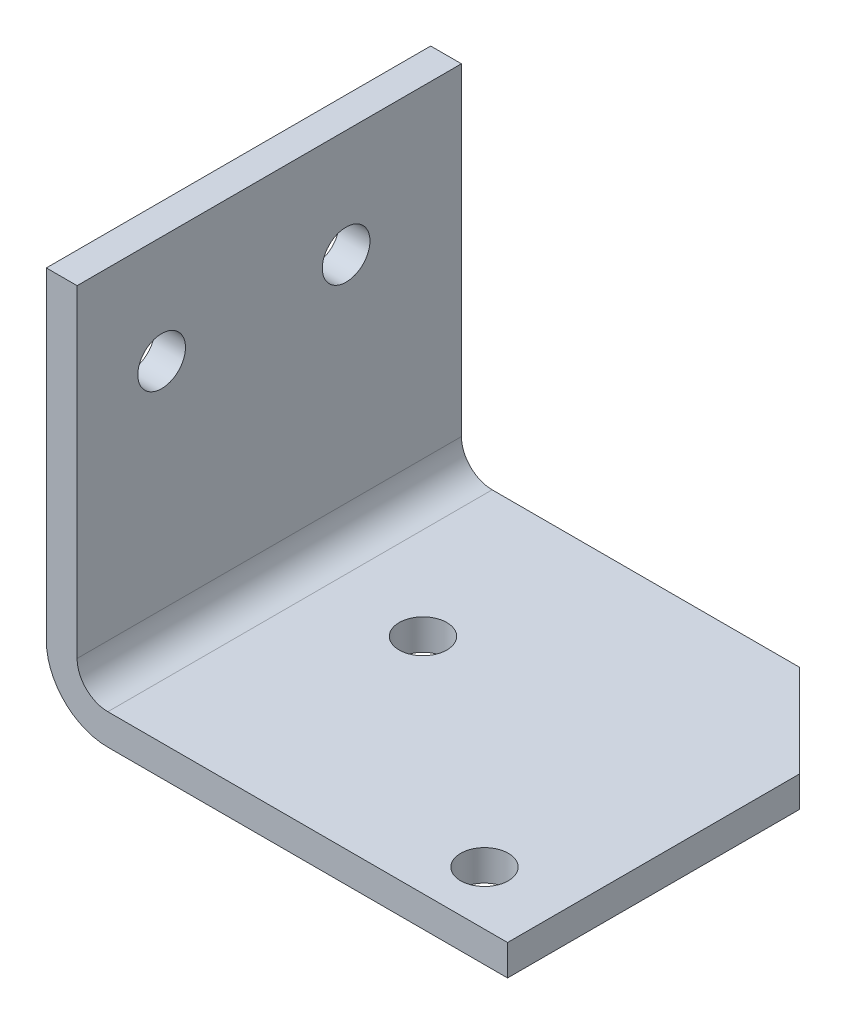
ISO-10303-21;
HEADER;
FILE_DESCRIPTION(('STEP AP214'),'2;1');
FILE_NAME('part.step','',(''),(''),'','','');
FILE_SCHEMA(('AUTOMOTIVE_DESIGN { 1 0 10303 214 1 1 1 1 }'));
ENDSEC;
DATA;
#1=APPLICATION_CONTEXT('core data for automotive mechanical design processes');
#2=APPLICATION_PROTOCOL_DEFINITION('international standard','automotive_design',2000,#1);
#3=PRODUCT_CONTEXT('',#1,'mechanical');
#4=PRODUCT('Part','Part','',(#3));
#5=PRODUCT_RELATED_PRODUCT_CATEGORY('part','',(#4));
#6=PRODUCT_DEFINITION_FORMATION('','',#4);
#7=PRODUCT_DEFINITION_CONTEXT('part definition',#1,'design');
#8=PRODUCT_DEFINITION('design','',#6,#7);
#9=PRODUCT_DEFINITION_SHAPE('','',#8);
#10=(LENGTH_UNIT() NAMED_UNIT(*) SI_UNIT(.MILLI.,.METRE.));
#11=(NAMED_UNIT(*) PLANE_ANGLE_UNIT() SI_UNIT($,.RADIAN.));
#12=(NAMED_UNIT(*) SI_UNIT($,.STERADIAN.) SOLID_ANGLE_UNIT());
#13=UNCERTAINTY_MEASURE_WITH_UNIT(LENGTH_MEASURE(1.E-05),#10,'distance_accuracy_value','');
#14=(GEOMETRIC_REPRESENTATION_CONTEXT(3) GLOBAL_UNCERTAINTY_ASSIGNED_CONTEXT((#13)) GLOBAL_UNIT_ASSIGNED_CONTEXT((#10,
#11,#12)) REPRESENTATION_CONTEXT('',''));
#15=CARTESIAN_POINT('',(0.,0.,0.));
#16=DIRECTION('',(0.,0.,1.));
#17=DIRECTION('',(1.,0.,0.));
#18=AXIS2_PLACEMENT_3D('',#15,#16,#17);
#19=CARTESIAN_POINT('',(0.,25.,25.));
#20=DIRECTION('',(1.,0.,0.));
#21=DIRECTION('',(0.,1.,0.));
#22=AXIS2_PLACEMENT_3D('',#19,#20,#21);
#23=PLANE('',#22);
#24=CARTESIAN_POINT('',(0.,18.,7.5));
#25=DIRECTION('',(-1.,0.,0.));
#26=DIRECTION('',(0.,-1.,0.));
#27=AXIS2_PLACEMENT_3D('',#24,#25,#26);
#28=CIRCLE('',#27,1.55);
#29=CARTESIAN_POINT('',(0.,16.45,7.5));
#30=VERTEX_POINT('',#29);
#31=EDGE_CURVE('E166',#30,#30,#28,.T.);
#32=ORIENTED_EDGE('',*,*,#31,.F.);
#33=EDGE_LOOP('',(#32));
#34=FACE_BOUND('',#33,.T.);
#35=CARTESIAN_POINT('',(0.,18.,19.5));
#36=DIRECTION('',(-1.,0.,0.));
#37=DIRECTION('',(0.,-1.,0.));
#38=AXIS2_PLACEMENT_3D('',#35,#36,#37);
#39=CIRCLE('',#38,1.55);
#40=CARTESIAN_POINT('',(0.,16.45,19.5));
#41=VERTEX_POINT('',#40);
#42=EDGE_CURVE('E216',#41,#41,#39,.T.);
#43=ORIENTED_EDGE('',*,*,#42,.F.);
#44=EDGE_LOOP('',(#43));
#45=FACE_BOUND('',#44,.T.);
#46=DIRECTION('',(0.,-1.,0.));
#47=VECTOR('',#46,1.);
#48=CARTESIAN_POINT('',(0.,25.,0.));
#49=LINE('',#48,#47);
#50=CARTESIAN_POINT('',(0.,25.,0.));
#51=VERTEX_POINT('',#50);
#52=CARTESIAN_POINT('',(0.,4.,0.));
#53=VERTEX_POINT('',#52);
#54=EDGE_CURVE('E145',#51,#53,#49,.T.);
#55=ORIENTED_EDGE('',*,*,#54,.T.);
#56=DIRECTION('',(0.,0.,-1.));
#57=VECTOR('',#56,1.);
#58=CARTESIAN_POINT('',(0.,4.,25.));
#59=LINE('',#58,#57);
#60=CARTESIAN_POINT('',(0.,4.,25.));
#61=VERTEX_POINT('',#60);
#62=EDGE_CURVE('E46',#53,#61,#59,.F.);
#63=ORIENTED_EDGE('',*,*,#62,.T.);
#64=DIRECTION('',(0.,-1.,0.));
#65=VECTOR('',#64,1.);
#66=CARTESIAN_POINT('',(0.,25.,25.));
#67=LINE('',#66,#65);
#68=CARTESIAN_POINT('',(0.,25.,25.));
#69=VERTEX_POINT('',#68);
#70=EDGE_CURVE('E119',#69,#61,#67,.T.);
#71=ORIENTED_EDGE('',*,*,#70,.F.);
#72=DIRECTION('',(0.,0.,-1.));
#73=VECTOR('',#72,1.);
#74=CARTESIAN_POINT('',(0.,25.,25.));
#75=LINE('',#74,#73);
#76=EDGE_CURVE('E144',#69,#51,#75,.T.);
#77=ORIENTED_EDGE('',*,*,#76,.T.);
#78=EDGE_LOOP('',(#55,#63,#71,#77));
#79=FACE_BOUND('',#78,.T.);
#80=ADVANCED_FACE('F38',(#34,#45,#79),#23,.F.);
#81=CARTESIAN_POINT('',(0.,0.,25.));
#82=DIRECTION('',(0.,1.,0.));
#83=DIRECTION('',(0.,0.,1.));
#84=AXIS2_PLACEMENT_3D('',#81,#82,#83);
#85=PLANE('',#84);
#86=CARTESIAN_POINT('',(25.0000000002013,0.,21.5));
#87=DIRECTION('',(0.,-1.,0.));
#88=DIRECTION('',(0.,0.,-1.));
#89=AXIS2_PLACEMENT_3D('',#86,#87,#88);
#90=CIRCLE('',#89,1.55);
#91=CARTESIAN_POINT('',(25.0000000002013,0.,19.95));
#92=VERTEX_POINT('',#91);
#93=EDGE_CURVE('E171',#92,#92,#90,.T.);
#94=ORIENTED_EDGE('',*,*,#93,.F.);
#95=EDGE_LOOP('',(#94));
#96=FACE_BOUND('',#95,.T.);
#97=CARTESIAN_POINT('',(10.0000000002013,0.,10.5));
#98=DIRECTION('',(0.,-1.,0.));
#99=DIRECTION('',(0.,0.,-1.));
#100=AXIS2_PLACEMENT_3D('',#97,#98,#99);
#101=CIRCLE('',#100,1.55);
#102=CARTESIAN_POINT('',(10.0000000002013,0.,8.95));
#103=VERTEX_POINT('',#102);
#104=EDGE_CURVE('E167',#103,#103,#101,.T.);
#105=ORIENTED_EDGE('',*,*,#104,.F.);
#106=EDGE_LOOP('',(#105));
#107=FACE_BOUND('',#106,.T.);
#108=DIRECTION('',(1.,0.,0.));
#109=VECTOR('',#108,1.);
#110=CARTESIAN_POINT('',(0.,0.,25.));
#111=LINE('',#110,#109);
#112=CARTESIAN_POINT('',(4.,0.,25.));
#113=VERTEX_POINT('',#112);
#114=CARTESIAN_POINT('',(30.,0.,25.));
#115=VERTEX_POINT('',#114);
#116=EDGE_CURVE('E108',#113,#115,#111,.T.);
#117=ORIENTED_EDGE('',*,*,#116,.F.);
#118=DIRECTION('',(0.,0.,-1.));
#119=VECTOR('',#118,1.);
#120=CARTESIAN_POINT('',(4.,0.,25.));
#121=LINE('',#120,#119);
#122=CARTESIAN_POINT('',(4.,0.,0.));
#123=VERTEX_POINT('',#122);
#124=EDGE_CURVE('E188',#113,#123,#121,.T.);
#125=ORIENTED_EDGE('',*,*,#124,.T.);
#126=DIRECTION('',(1.,0.,0.));
#127=VECTOR('',#126,1.);
#128=CARTESIAN_POINT('',(0.,0.,0.));
#129=LINE('',#128,#127);
#130=CARTESIAN_POINT('',(24.,0.,0.));
#131=VERTEX_POINT('',#130);
#132=EDGE_CURVE('E147',#123,#131,#129,.T.);
#133=ORIENTED_EDGE('',*,*,#132,.T.);
#134=DIRECTION('',(-0.707106781186549,0.,-0.707106781186546));
#135=VECTOR('',#134,1.);
#136=CARTESIAN_POINT('',(30.,0.,6.));
#137=LINE('',#136,#135);
#138=CARTESIAN_POINT('',(30.,0.,6.));
#139=VERTEX_POINT('',#138);
#140=EDGE_CURVE('E125',#131,#139,#137,.F.);
#141=ORIENTED_EDGE('',*,*,#140,.T.);
#142=DIRECTION('',(0.,0.,-1.));
#143=VECTOR('',#142,1.);
#144=CARTESIAN_POINT('',(30.,0.,25.));
#145=LINE('',#144,#143);
#146=EDGE_CURVE('E122',#115,#139,#145,.T.);
#147=ORIENTED_EDGE('',*,*,#146,.F.);
#148=EDGE_LOOP('',(#117,#125,#133,#141,#147));
#149=FACE_BOUND('',#148,.T.);
#150=ADVANCED_FACE('F123',(#96,#107,#149),#85,.F.);
#151=CARTESIAN_POINT('',(30.,0.,25.));
#152=DIRECTION('',(-1.,0.,0.));
#153=DIRECTION('',(0.,0.,1.));
#154=AXIS2_PLACEMENT_3D('',#151,#152,#153);
#155=PLANE('',#154);
#156=ORIENTED_EDGE('',*,*,#146,.T.);
#157=DIRECTION('',(0.,1.,0.));
#158=VECTOR('',#157,1.);
#159=CARTESIAN_POINT('',(30.,0.,6.));
#160=LINE('',#159,#158);
#161=CARTESIAN_POINT('',(30.,2.,6.));
#162=VERTEX_POINT('',#161);
#163=EDGE_CURVE('E129',#139,#162,#160,.T.);
#164=ORIENTED_EDGE('',*,*,#163,.T.);
#165=DIRECTION('',(0.,0.,-1.));
#166=VECTOR('',#165,1.);
#167=CARTESIAN_POINT('',(30.,2.,25.));
#168=LINE('',#167,#166);
#169=CARTESIAN_POINT('',(30.,2.,25.));
#170=VERTEX_POINT('',#169);
#171=EDGE_CURVE('E130',#170,#162,#168,.T.);
#172=ORIENTED_EDGE('',*,*,#171,.F.);
#173=DIRECTION('',(0.,1.,0.));
#174=VECTOR('',#173,1.);
#175=CARTESIAN_POINT('',(30.,0.,25.));
#176=LINE('',#175,#174);
#177=EDGE_CURVE('E113',#115,#170,#176,.T.);
#178=ORIENTED_EDGE('',*,*,#177,.F.);
#179=EDGE_LOOP('',(#156,#164,#172,#178));
#180=FACE_BOUND('',#179,.T.);
#181=ADVANCED_FACE('F132',(#180),#155,.F.);
#182=CARTESIAN_POINT('',(30.,2.,25.));
#183=DIRECTION('',(0.,-1.,0.));
#184=DIRECTION('',(1.,0.,0.));
#185=AXIS2_PLACEMENT_3D('',#182,#183,#184);
#186=PLANE('',#185);
#187=CARTESIAN_POINT('',(25.0000000002013,2.,21.5));
#188=DIRECTION('',(0.,-1.,0.));
#189=DIRECTION('',(1.,0.,0.));
#190=AXIS2_PLACEMENT_3D('',#187,#188,#189);
#191=CIRCLE('',#190,1.55);
#192=CARTESIAN_POINT('',(26.5500000002013,2.,21.5));
#193=VERTEX_POINT('',#192);
#194=EDGE_CURVE('E168',#193,#193,#191,.T.);
#195=ORIENTED_EDGE('',*,*,#194,.T.);
#196=EDGE_LOOP('',(#195));
#197=FACE_BOUND('',#196,.T.);
#198=CARTESIAN_POINT('',(10.0000000002013,2.,10.5));
#199=DIRECTION('',(0.,-1.,0.));
#200=DIRECTION('',(1.,0.,0.));
#201=AXIS2_PLACEMENT_3D('',#198,#199,#200);
#202=CIRCLE('',#201,1.55);
#203=CARTESIAN_POINT('',(11.5500000002013,2.,10.5));
#204=VERTEX_POINT('',#203);
#205=EDGE_CURVE('E163',#204,#204,#202,.T.);
#206=ORIENTED_EDGE('',*,*,#205,.T.);
#207=EDGE_LOOP('',(#206));
#208=FACE_BOUND('',#207,.T.);
#209=DIRECTION('',(-1.,0.,0.));
#210=VECTOR('',#209,1.);
#211=CARTESIAN_POINT('',(30.,2.,0.));
#212=LINE('',#211,#210);
#213=CARTESIAN_POINT('',(24.,2.,0.));
#214=VERTEX_POINT('',#213);
#215=CARTESIAN_POINT('',(4.00000000000001,2.,0.));
#216=VERTEX_POINT('',#215);
#217=EDGE_CURVE('E150',#214,#216,#212,.T.);
#218=ORIENTED_EDGE('',*,*,#217,.T.);
#219=DIRECTION('',(0.,0.,-1.));
#220=VECTOR('',#219,1.);
#221=CARTESIAN_POINT('',(4.,2.,25.));
#222=LINE('',#221,#220);
#223=CARTESIAN_POINT('',(4.00000000000001,2.,25.));
#224=VERTEX_POINT('',#223);
#225=EDGE_CURVE('E182',#216,#224,#222,.F.);
#226=ORIENTED_EDGE('',*,*,#225,.T.);
#227=DIRECTION('',(-1.,0.,0.));
#228=VECTOR('',#227,1.);
#229=CARTESIAN_POINT('',(30.,2.,25.));
#230=LINE('',#229,#228);
#231=EDGE_CURVE('E135',#170,#224,#230,.T.);
#232=ORIENTED_EDGE('',*,*,#231,.F.);
#233=ORIENTED_EDGE('',*,*,#171,.T.);
#234=DIRECTION('',(0.707106781186549,0.,0.707106781186546));
#235=VECTOR('',#234,1.);
#236=CARTESIAN_POINT('',(30.,2.,6.));
#237=LINE('',#236,#235);
#238=EDGE_CURVE('E173',#162,#214,#237,.F.);
#239=ORIENTED_EDGE('',*,*,#238,.T.);
#240=EDGE_LOOP('',(#218,#226,#232,#233,#239));
#241=FACE_BOUND('',#240,.T.);
#242=ADVANCED_FACE('F197',(#197,#208,#241),#186,.F.);
#243=CARTESIAN_POINT('',(2.,2.,25.));
#244=DIRECTION('',(-1.,0.,0.));
#245=DIRECTION('',(0.,-1.,0.));
#246=AXIS2_PLACEMENT_3D('',#243,#244,#245);
#247=PLANE('',#246);
#248=CARTESIAN_POINT('',(2.,18.,7.5));
#249=DIRECTION('',(-1.,0.,0.));
#250=DIRECTION('',(0.,-1.,0.));
#251=AXIS2_PLACEMENT_3D('',#248,#249,#250);
#252=CIRCLE('',#251,1.55);
#253=CARTESIAN_POINT('',(2.,16.45,7.5));
#254=VERTEX_POINT('',#253);
#255=EDGE_CURVE('E219',#254,#254,#252,.F.);
#256=ORIENTED_EDGE('',*,*,#255,.F.);
#257=EDGE_LOOP('',(#256));
#258=FACE_BOUND('',#257,.T.);
#259=CARTESIAN_POINT('',(2.,18.,19.5));
#260=DIRECTION('',(-1.,0.,0.));
#261=DIRECTION('',(0.,-1.,0.));
#262=AXIS2_PLACEMENT_3D('',#259,#260,#261);
#263=CIRCLE('',#262,1.55);
#264=CARTESIAN_POINT('',(2.,16.45,19.5));
#265=VERTEX_POINT('',#264);
#266=EDGE_CURVE('E148',#265,#265,#263,.F.);
#267=ORIENTED_EDGE('',*,*,#266,.F.);
#268=EDGE_LOOP('',(#267));
#269=FACE_BOUND('',#268,.T.);
#270=DIRECTION('',(0.,1.,0.));
#271=VECTOR('',#270,1.);
#272=CARTESIAN_POINT('',(2.,2.,25.));
#273=LINE('',#272,#271);
#274=CARTESIAN_POINT('',(2.,4.,25.));
#275=VERTEX_POINT('',#274);
#276=CARTESIAN_POINT('',(2.,25.,25.));
#277=VERTEX_POINT('',#276);
#278=EDGE_CURVE('E137',#275,#277,#273,.T.);
#279=ORIENTED_EDGE('',*,*,#278,.F.);
#280=DIRECTION('',(0.,0.,-1.));
#281=VECTOR('',#280,1.);
#282=CARTESIAN_POINT('',(2.,4.,0.));
#283=LINE('',#282,#281);
#284=CARTESIAN_POINT('',(2.,4.,0.));
#285=VERTEX_POINT('',#284);
#286=EDGE_CURVE('E179',#275,#285,#283,.T.);
#287=ORIENTED_EDGE('',*,*,#286,.T.);
#288=DIRECTION('',(0.,1.,0.));
#289=VECTOR('',#288,1.);
#290=CARTESIAN_POINT('',(2.,2.,0.));
#291=LINE('',#290,#289);
#292=CARTESIAN_POINT('',(2.,25.,0.));
#293=VERTEX_POINT('',#292);
#294=EDGE_CURVE('E153',#285,#293,#291,.T.);
#295=ORIENTED_EDGE('',*,*,#294,.T.);
#296=DIRECTION('',(0.,0.,-1.));
#297=VECTOR('',#296,1.);
#298=CARTESIAN_POINT('',(2.,25.,25.));
#299=LINE('',#298,#297);
#300=EDGE_CURVE('E159',#277,#293,#299,.T.);
#301=ORIENTED_EDGE('',*,*,#300,.F.);
#302=EDGE_LOOP('',(#279,#287,#295,#301));
#303=FACE_BOUND('',#302,.T.);
#304=ADVANCED_FACE('F206',(#258,#269,#303),#247,.F.);
#305=CARTESIAN_POINT('',(2.,25.,25.));
#306=DIRECTION('',(0.,-1.,0.));
#307=DIRECTION('',(0.,0.,-1.));
#308=AXIS2_PLACEMENT_3D('',#305,#306,#307);
#309=PLANE('',#308);
#310=DIRECTION('',(-1.,0.,0.));
#311=VECTOR('',#310,1.);
#312=CARTESIAN_POINT('',(2.,25.,0.));
#313=LINE('',#312,#311);
#314=EDGE_CURVE('E155',#293,#51,#313,.T.);
#315=ORIENTED_EDGE('',*,*,#314,.T.);
#316=ORIENTED_EDGE('',*,*,#76,.F.);
#317=DIRECTION('',(-1.,0.,0.));
#318=VECTOR('',#317,1.);
#319=CARTESIAN_POINT('',(2.,25.,25.));
#320=LINE('',#319,#318);
#321=EDGE_CURVE('E142',#277,#69,#320,.T.);
#322=ORIENTED_EDGE('',*,*,#321,.F.);
#323=ORIENTED_EDGE('',*,*,#300,.T.);
#324=EDGE_LOOP('',(#315,#316,#322,#323));
#325=FACE_BOUND('',#324,.T.);
#326=ADVANCED_FACE('F211',(#325),#309,.F.);
#327=CARTESIAN_POINT('',(0.,0.,25.));
#328=DIRECTION('',(0.,0.,1.));
#329=DIRECTION('',(1.,0.,0.));
#330=AXIS2_PLACEMENT_3D('',#327,#328,#329);
#331=PLANE('',#330);
#332=ORIENTED_EDGE('',*,*,#70,.T.);
#333=CARTESIAN_POINT('',(4.,4.,25.));
#334=DIRECTION('',(0.,0.,1.));
#335=DIRECTION('',(1.,0.,0.));
#336=AXIS2_PLACEMENT_3D('',#333,#334,#335);
#337=CIRCLE('',#336,4.);
#338=EDGE_CURVE('E11',#61,#113,#337,.T.);
#339=ORIENTED_EDGE('',*,*,#338,.T.);
#340=ORIENTED_EDGE('',*,*,#116,.T.);
#341=ORIENTED_EDGE('',*,*,#177,.T.);
#342=ORIENTED_EDGE('',*,*,#231,.T.);
#343=CARTESIAN_POINT('',(4.,4.,25.));
#344=DIRECTION('',(0.,0.,1.));
#345=DIRECTION('',(1.,0.,0.));
#346=AXIS2_PLACEMENT_3D('',#343,#344,#345);
#347=CIRCLE('',#346,2.);
#348=EDGE_CURVE('E186',#224,#275,#347,.F.);
#349=ORIENTED_EDGE('',*,*,#348,.T.);
#350=ORIENTED_EDGE('',*,*,#278,.T.);
#351=ORIENTED_EDGE('',*,*,#321,.T.);
#352=EDGE_LOOP('',(#332,#339,#340,#341,#342,#349,#350,#351));
#353=FACE_BOUND('',#352,.T.);
#354=ADVANCED_FACE('F110',(#353),#331,.T.);
#355=CARTESIAN_POINT('',(0.,0.,0.));
#356=DIRECTION('',(0.,0.,1.));
#357=DIRECTION('',(1.,0.,0.));
#358=AXIS2_PLACEMENT_3D('',#355,#356,#357);
#359=PLANE('',#358);
#360=ORIENTED_EDGE('',*,*,#132,.F.);
#361=CARTESIAN_POINT('',(4.,4.,0.));
#362=DIRECTION('',(0.,0.,1.));
#363=DIRECTION('',(1.,0.,0.));
#364=AXIS2_PLACEMENT_3D('',#361,#362,#363);
#365=CIRCLE('',#364,4.);
#366=EDGE_CURVE('E60',#123,#53,#365,.F.);
#367=ORIENTED_EDGE('',*,*,#366,.T.);
#368=ORIENTED_EDGE('',*,*,#54,.F.);
#369=ORIENTED_EDGE('',*,*,#314,.F.);
#370=ORIENTED_EDGE('',*,*,#294,.F.);
#371=CARTESIAN_POINT('',(4.,4.,0.));
#372=DIRECTION('',(0.,0.,1.));
#373=DIRECTION('',(1.,0.,0.));
#374=AXIS2_PLACEMENT_3D('',#371,#372,#373);
#375=CIRCLE('',#374,2.);
#376=EDGE_CURVE('E184',#285,#216,#375,.T.);
#377=ORIENTED_EDGE('',*,*,#376,.T.);
#378=ORIENTED_EDGE('',*,*,#217,.F.);
#379=DIRECTION('',(0.,-1.,0.));
#380=VECTOR('',#379,1.);
#381=CARTESIAN_POINT('',(24.,0.,0.));
#382=LINE('',#381,#380);
#383=EDGE_CURVE('E175',#214,#131,#382,.T.);
#384=ORIENTED_EDGE('',*,*,#383,.T.);
#385=EDGE_LOOP('',(#360,#367,#368,#369,#370,#377,#378,#384));
#386=FACE_BOUND('',#385,.T.);
#387=ADVANCED_FACE('F191',(#386),#359,.F.);
#388=CARTESIAN_POINT('',(6.38406204335659,18.,19.5));
#389=DIRECTION('',(-1.,0.,0.));
#390=DIRECTION('',(0.,-1.,0.));
#391=AXIS2_PLACEMENT_3D('',#388,#389,#390);
#392=CYLINDRICAL_SURFACE('',#391,1.55);
#393=ORIENTED_EDGE('',*,*,#266,.T.);
#394=EDGE_LOOP('',(#393));
#395=FACE_BOUND('',#394,.T.);
#396=ORIENTED_EDGE('',*,*,#42,.T.);
#397=EDGE_LOOP('',(#396));
#398=FACE_BOUND('',#397,.T.);
#399=ADVANCED_FACE('F279',(#395,#398),#392,.F.);
#400=CARTESIAN_POINT('',(6.38406204335659,18.,7.5));
#401=DIRECTION('',(-1.,0.,0.));
#402=DIRECTION('',(0.,-1.,0.));
#403=AXIS2_PLACEMENT_3D('',#400,#401,#402);
#404=CYLINDRICAL_SURFACE('',#403,1.55);
#405=ORIENTED_EDGE('',*,*,#255,.T.);
#406=EDGE_LOOP('',(#405));
#407=FACE_BOUND('',#406,.T.);
#408=ORIENTED_EDGE('',*,*,#31,.T.);
#409=EDGE_LOOP('',(#408));
#410=FACE_BOUND('',#409,.T.);
#411=ADVANCED_FACE('F240',(#407,#410),#404,.F.);
#412=CARTESIAN_POINT('',(10.0000000002013,25.,10.5));
#413=DIRECTION('',(0.,-1.,0.));
#414=DIRECTION('',(0.,0.,-1.));
#415=AXIS2_PLACEMENT_3D('',#412,#413,#414);
#416=CYLINDRICAL_SURFACE('',#415,1.55);
#417=ORIENTED_EDGE('',*,*,#104,.T.);
#418=EDGE_LOOP('',(#417));
#419=FACE_BOUND('',#418,.T.);
#420=ORIENTED_EDGE('',*,*,#205,.F.);
#421=EDGE_LOOP('',(#420));
#422=FACE_BOUND('',#421,.T.);
#423=ADVANCED_FACE('F237',(#419,#422),#416,.F.);
#424=CARTESIAN_POINT('',(25.0000000002013,25.,21.5));
#425=DIRECTION('',(0.,-1.,0.));
#426=DIRECTION('',(0.,0.,-1.));
#427=AXIS2_PLACEMENT_3D('',#424,#425,#426);
#428=CYLINDRICAL_SURFACE('',#427,1.55);
#429=ORIENTED_EDGE('',*,*,#93,.T.);
#430=EDGE_LOOP('',(#429));
#431=FACE_BOUND('',#430,.T.);
#432=ORIENTED_EDGE('',*,*,#194,.F.);
#433=EDGE_LOOP('',(#432));
#434=FACE_BOUND('',#433,.T.);
#435=ADVANCED_FACE('F229',(#431,#434),#428,.F.);
#436=CARTESIAN_POINT('',(30.,0.,6.));
#437=DIRECTION('',(-0.707106781186546,0.,0.707106781186549));
#438=DIRECTION('',(0.,1.,0.));
#439=AXIS2_PLACEMENT_3D('',#436,#437,#438);
#440=PLANE('',#439);
#441=ORIENTED_EDGE('',*,*,#140,.F.);
#442=ORIENTED_EDGE('',*,*,#383,.F.);
#443=ORIENTED_EDGE('',*,*,#238,.F.);
#444=ORIENTED_EDGE('',*,*,#163,.F.);
#445=EDGE_LOOP('',(#441,#442,#443,#444));
#446=FACE_BOUND('',#445,.T.);
#447=ADVANCED_FACE('F195',(#446),#440,.F.);
#448=CARTESIAN_POINT('',(4.,4.,25.));
#449=DIRECTION('',(0.,0.,1.));
#450=DIRECTION('',(1.,0.,0.));
#451=AXIS2_PLACEMENT_3D('',#448,#449,#450);
#452=CYLINDRICAL_SURFACE('',#451,2.);
#453=ORIENTED_EDGE('',*,*,#348,.F.);
#454=ORIENTED_EDGE('',*,*,#225,.F.);
#455=ORIENTED_EDGE('',*,*,#376,.F.);
#456=ORIENTED_EDGE('',*,*,#286,.F.);
#457=EDGE_LOOP('',(#453,#454,#455,#456));
#458=FACE_BOUND('',#457,.T.);
#459=ADVANCED_FACE('F203',(#458),#452,.F.);
#460=CARTESIAN_POINT('',(4.,4.,25.));
#461=DIRECTION('',(0.,0.,-1.));
#462=DIRECTION('',(-1.,0.,0.));
#463=AXIS2_PLACEMENT_3D('',#460,#461,#462);
#464=CYLINDRICAL_SURFACE('',#463,4.);
#465=ORIENTED_EDGE('',*,*,#338,.F.);
#466=ORIENTED_EDGE('',*,*,#62,.F.);
#467=ORIENTED_EDGE('',*,*,#366,.F.);
#468=ORIENTED_EDGE('',*,*,#124,.F.);
#469=EDGE_LOOP('',(#465,#466,#467,#468));
#470=FACE_BOUND('',#469,.T.);
#471=ADVANCED_FACE('F40',(#470),#464,.T.);
#472=CLOSED_SHELL('',(#80,#150,#181,#242,#304,#326,#354,#387,#399,#411,#423,#435,#447,#459,#471));
#473=MANIFOLD_SOLID_BREP('B2',#472);
#474=ADVANCED_BREP_SHAPE_REPRESENTATION('',(#18,#473),#14);
#475=SHAPE_DEFINITION_REPRESENTATION(#9,#474);
ENDSEC;
END-ISO-10303-21;
